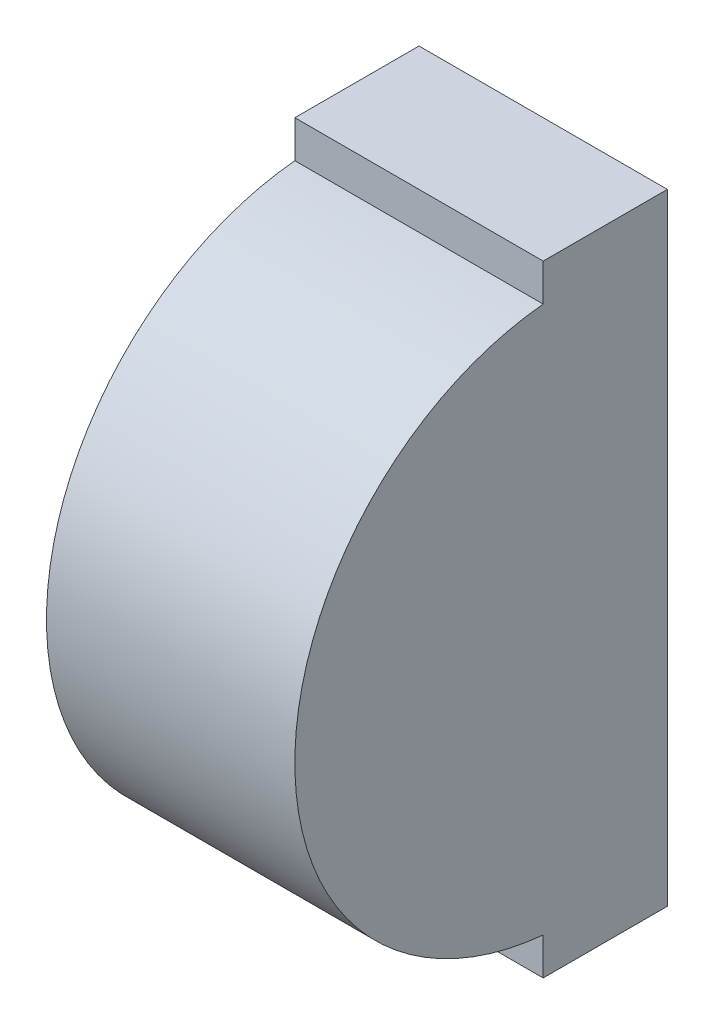
ISO-10303-21;
HEADER;
FILE_DESCRIPTION(('STEP AP214'),'2;1');
FILE_NAME('part.step','',(''),(''),'','','');
FILE_SCHEMA(('AUTOMOTIVE_DESIGN { 1 0 10303 214 1 1 1 1 }'));
ENDSEC;
DATA;
#1=APPLICATION_CONTEXT('core data for automotive mechanical design processes');
#2=APPLICATION_PROTOCOL_DEFINITION('international standard','automotive_design',2000,#1);
#3=PRODUCT_CONTEXT('',#1,'mechanical');
#4=PRODUCT('Part','Part','',(#3));
#5=PRODUCT_RELATED_PRODUCT_CATEGORY('part','',(#4));
#6=PRODUCT_DEFINITION_FORMATION('','',#4);
#7=PRODUCT_DEFINITION_CONTEXT('part definition',#1,'design');
#8=PRODUCT_DEFINITION('design','',#6,#7);
#9=PRODUCT_DEFINITION_SHAPE('','',#8);
#10=(LENGTH_UNIT() NAMED_UNIT(*) SI_UNIT(.MILLI.,.METRE.));
#11=(NAMED_UNIT(*) PLANE_ANGLE_UNIT() SI_UNIT($,.RADIAN.));
#12=(NAMED_UNIT(*) SI_UNIT($,.STERADIAN.) SOLID_ANGLE_UNIT());
#13=UNCERTAINTY_MEASURE_WITH_UNIT(LENGTH_MEASURE(1.E-05),#10,'distance_accuracy_value','');
#14=(GEOMETRIC_REPRESENTATION_CONTEXT(3) GLOBAL_UNCERTAINTY_ASSIGNED_CONTEXT((#13)) GLOBAL_UNIT_ASSIGNED_CONTEXT((#10,
#11,#12)) REPRESENTATION_CONTEXT('',''));
#15=CARTESIAN_POINT('',(0.,0.,0.));
#16=DIRECTION('',(0.,0.,1.));
#17=DIRECTION('',(1.,0.,0.));
#18=AXIS2_PLACEMENT_3D('',#15,#16,#17);
#19=CARTESIAN_POINT('',(0.,0.,0.));
#20=DIRECTION('',(1.,0.,0.));
#21=DIRECTION('',(0.,1.,0.));
#22=AXIS2_PLACEMENT_3D('',#19,#20,#21);
#23=PLANE('',#22);
#24=DIRECTION('',(0.,0.,-1.));
#25=VECTOR('',#24,1.);
#26=CARTESIAN_POINT('',(0.,-1.25,0.5));
#27=LINE('',#26,#25);
#28=CARTESIAN_POINT('',(0.,-1.25,0.5));
#29=VERTEX_POINT('',#28);
#30=CARTESIAN_POINT('',(0.,-1.25,0.));
#31=VERTEX_POINT('',#30);
#32=EDGE_CURVE('E104',#29,#31,#27,.T.);
#33=ORIENTED_EDGE('',*,*,#32,.F.);
#34=DIRECTION('',(0.,-1.,0.));
#35=VECTOR('',#34,1.);
#36=CARTESIAN_POINT('',(0.,-1.1,0.5));
#37=LINE('',#36,#35);
#38=CARTESIAN_POINT('',(0.,-1.1,0.5));
#39=VERTEX_POINT('',#38);
#40=EDGE_CURVE('E36',#39,#29,#37,.T.);
#41=ORIENTED_EDGE('',*,*,#40,.F.);
#42=CARTESIAN_POINT('',(0.,0.,0.395));
#43=DIRECTION('',(1.,0.,0.));
#44=DIRECTION('',(0.,0.995475113122172,0.0950226244343873));
#45=AXIS2_PLACEMENT_3D('',#42,#43,#44);
#46=CIRCLE('',#45,1.105);
#47=CARTESIAN_POINT('',(0.,1.1,0.5));
#48=VERTEX_POINT('',#47);
#49=EDGE_CURVE('E113',#48,#39,#46,.T.);
#50=ORIENTED_EDGE('',*,*,#49,.F.);
#51=DIRECTION('',(0.,-1.,0.));
#52=VECTOR('',#51,1.);
#53=CARTESIAN_POINT('',(0.,1.25,0.5));
#54=LINE('',#53,#52);
#55=CARTESIAN_POINT('',(0.,1.25,0.5));
#56=VERTEX_POINT('',#55);
#57=EDGE_CURVE('E90',#56,#48,#54,.T.);
#58=ORIENTED_EDGE('',*,*,#57,.F.);
#59=DIRECTION('',(0.,0.,1.));
#60=VECTOR('',#59,1.);
#61=CARTESIAN_POINT('',(0.,1.25,0.));
#62=LINE('',#61,#60);
#63=CARTESIAN_POINT('',(0.,1.25,0.));
#64=VERTEX_POINT('',#63);
#65=EDGE_CURVE('E88',#64,#56,#62,.T.);
#66=ORIENTED_EDGE('',*,*,#65,.F.);
#67=DIRECTION('',(0.,1.,0.));
#68=VECTOR('',#67,1.);
#69=CARTESIAN_POINT('',(0.,-1.25,0.));
#70=LINE('',#69,#68);
#71=EDGE_CURVE('E27',#31,#64,#70,.T.);
#72=ORIENTED_EDGE('',*,*,#71,.F.);
#73=EDGE_LOOP('',(#33,#41,#50,#58,#66,#72));
#74=FACE_BOUND('',#73,.T.);
#75=ADVANCED_FACE('F17',(#74),#23,.F.);
#76=CARTESIAN_POINT('',(0.,-1.25,0.));
#77=DIRECTION('',(0.,0.,-1.));
#78=DIRECTION('',(0.,1.,0.));
#79=AXIS2_PLACEMENT_3D('',#76,#77,#78);
#80=PLANE('',#79);
#81=DIRECTION('',(1.,0.,0.));
#82=VECTOR('',#81,1.);
#83=CARTESIAN_POINT('',(0.,1.25,0.));
#84=LINE('',#83,#82);
#85=CARTESIAN_POINT('',(1.,1.25,0.));
#86=VERTEX_POINT('',#85);
#87=EDGE_CURVE('E11',#64,#86,#84,.T.);
#88=ORIENTED_EDGE('',*,*,#87,.T.);
#89=DIRECTION('',(0.,1.,0.));
#90=VECTOR('',#89,1.);
#91=CARTESIAN_POINT('',(1.,-1.25,0.));
#92=LINE('',#91,#90);
#93=CARTESIAN_POINT('',(1.,-1.25,0.));
#94=VERTEX_POINT('',#93);
#95=EDGE_CURVE('E92',#94,#86,#92,.T.);
#96=ORIENTED_EDGE('',*,*,#95,.F.);
#97=DIRECTION('',(1.,0.,0.));
#98=VECTOR('',#97,1.);
#99=CARTESIAN_POINT('',(0.,-1.25,0.));
#100=LINE('',#99,#98);
#101=EDGE_CURVE('E98',#31,#94,#100,.T.);
#102=ORIENTED_EDGE('',*,*,#101,.F.);
#103=ORIENTED_EDGE('',*,*,#71,.T.);
#104=EDGE_LOOP('',(#88,#96,#102,#103));
#105=FACE_BOUND('',#104,.T.);
#106=ADVANCED_FACE('F130',(#105),#80,.T.);
#107=CARTESIAN_POINT('',(0.,-1.25,0.5));
#108=DIRECTION('',(0.,-1.,0.));
#109=DIRECTION('',(0.,0.,-1.));
#110=AXIS2_PLACEMENT_3D('',#107,#108,#109);
#111=PLANE('',#110);
#112=ORIENTED_EDGE('',*,*,#101,.T.);
#113=DIRECTION('',(0.,0.,-1.));
#114=VECTOR('',#113,1.);
#115=CARTESIAN_POINT('',(1.,-1.25,0.5));
#116=LINE('',#115,#114);
#117=CARTESIAN_POINT('',(1.,-1.25,0.5));
#118=VERTEX_POINT('',#117);
#119=EDGE_CURVE('E101',#118,#94,#116,.T.);
#120=ORIENTED_EDGE('',*,*,#119,.F.);
#121=DIRECTION('',(1.,0.,0.));
#122=VECTOR('',#121,1.);
#123=CARTESIAN_POINT('',(0.,-1.25,0.5));
#124=LINE('',#123,#122);
#125=EDGE_CURVE('E107',#29,#118,#124,.T.);
#126=ORIENTED_EDGE('',*,*,#125,.F.);
#127=ORIENTED_EDGE('',*,*,#32,.T.);
#128=EDGE_LOOP('',(#112,#120,#126,#127));
#129=FACE_BOUND('',#128,.T.);
#130=ADVANCED_FACE('F127',(#129),#111,.T.);
#131=CARTESIAN_POINT('',(0.,-1.1,0.5));
#132=DIRECTION('',(0.,0.,1.));
#133=DIRECTION('',(0.,-1.,0.));
#134=AXIS2_PLACEMENT_3D('',#131,#132,#133);
#135=PLANE('',#134);
#136=ORIENTED_EDGE('',*,*,#125,.T.);
#137=DIRECTION('',(0.,-1.,0.));
#138=VECTOR('',#137,1.);
#139=CARTESIAN_POINT('',(1.,-1.1,0.5));
#140=LINE('',#139,#138);
#141=CARTESIAN_POINT('',(1.,-1.1,0.5));
#142=VERTEX_POINT('',#141);
#143=EDGE_CURVE('E106',#142,#118,#140,.T.);
#144=ORIENTED_EDGE('',*,*,#143,.F.);
#145=DIRECTION('',(1.,0.,0.));
#146=VECTOR('',#145,1.);
#147=CARTESIAN_POINT('',(0.,-1.1,0.5));
#148=LINE('',#147,#146);
#149=EDGE_CURVE('E111',#39,#142,#148,.T.);
#150=ORIENTED_EDGE('',*,*,#149,.F.);
#151=ORIENTED_EDGE('',*,*,#40,.T.);
#152=EDGE_LOOP('',(#136,#144,#150,#151));
#153=FACE_BOUND('',#152,.T.);
#154=ADVANCED_FACE('F119',(#153),#135,.T.);
#155=CARTESIAN_POINT('',(0.,0.,0.395));
#156=DIRECTION('',(1.,0.,0.));
#157=DIRECTION('',(0.,1.,0.));
#158=AXIS2_PLACEMENT_3D('',#155,#156,#157);
#159=CYLINDRICAL_SURFACE('',#158,1.105);
#160=ORIENTED_EDGE('',*,*,#149,.T.);
#161=CARTESIAN_POINT('',(1.,0.,0.395));
#162=DIRECTION('',(1.,0.,0.));
#163=DIRECTION('',(0.,0.995475113122172,0.0950226244343873));
#164=AXIS2_PLACEMENT_3D('',#161,#162,#163);
#165=CIRCLE('',#164,1.105);
#166=CARTESIAN_POINT('',(1.,1.1,0.5));
#167=VERTEX_POINT('',#166);
#168=EDGE_CURVE('E70',#167,#142,#165,.T.);
#169=ORIENTED_EDGE('',*,*,#168,.F.);
#170=DIRECTION('',(1.,0.,0.));
#171=VECTOR('',#170,1.);
#172=CARTESIAN_POINT('',(0.,1.1,0.5));
#173=LINE('',#172,#171);
#174=EDGE_CURVE('E80',#48,#167,#173,.T.);
#175=ORIENTED_EDGE('',*,*,#174,.F.);
#176=ORIENTED_EDGE('',*,*,#49,.T.);
#177=EDGE_LOOP('',(#160,#169,#175,#176));
#178=FACE_BOUND('',#177,.T.);
#179=ADVANCED_FACE('F117',(#178),#159,.T.);
#180=CARTESIAN_POINT('',(0.,1.25,0.5));
#181=DIRECTION('',(0.,0.,1.));
#182=DIRECTION('',(0.,-1.,0.));
#183=AXIS2_PLACEMENT_3D('',#180,#181,#182);
#184=PLANE('',#183);
#185=ORIENTED_EDGE('',*,*,#174,.T.);
#186=DIRECTION('',(0.,-1.,0.));
#187=VECTOR('',#186,1.);
#188=CARTESIAN_POINT('',(1.,1.25,0.5));
#189=LINE('',#188,#187);
#190=CARTESIAN_POINT('',(1.,1.25,0.5));
#191=VERTEX_POINT('',#190);
#192=EDGE_CURVE('E76',#191,#167,#189,.T.);
#193=ORIENTED_EDGE('',*,*,#192,.F.);
#194=DIRECTION('',(1.,0.,0.));
#195=VECTOR('',#194,1.);
#196=CARTESIAN_POINT('',(0.,1.25,0.5));
#197=LINE('',#196,#195);
#198=EDGE_CURVE('E79',#56,#191,#197,.T.);
#199=ORIENTED_EDGE('',*,*,#198,.F.);
#200=ORIENTED_EDGE('',*,*,#57,.T.);
#201=EDGE_LOOP('',(#185,#193,#199,#200));
#202=FACE_BOUND('',#201,.T.);
#203=ADVANCED_FACE('F78',(#202),#184,.T.);
#204=CARTESIAN_POINT('',(0.,1.25,0.));
#205=DIRECTION('',(0.,1.,0.));
#206=DIRECTION('',(0.,0.,1.));
#207=AXIS2_PLACEMENT_3D('',#204,#205,#206);
#208=PLANE('',#207);
#209=ORIENTED_EDGE('',*,*,#198,.T.);
#210=DIRECTION('',(0.,0.,1.));
#211=VECTOR('',#210,1.);
#212=CARTESIAN_POINT('',(1.,1.25,0.));
#213=LINE('',#212,#211);
#214=EDGE_CURVE('E21',#86,#191,#213,.T.);
#215=ORIENTED_EDGE('',*,*,#214,.F.);
#216=ORIENTED_EDGE('',*,*,#87,.F.);
#217=ORIENTED_EDGE('',*,*,#65,.T.);
#218=EDGE_LOOP('',(#209,#215,#216,#217));
#219=FACE_BOUND('',#218,.T.);
#220=ADVANCED_FACE('F86',(#219),#208,.T.);
#221=CARTESIAN_POINT('',(1.,0.,0.));
#222=DIRECTION('',(1.,0.,0.));
#223=DIRECTION('',(0.,1.,0.));
#224=AXIS2_PLACEMENT_3D('',#221,#222,#223);
#225=PLANE('',#224);
#226=ORIENTED_EDGE('',*,*,#214,.T.);
#227=ORIENTED_EDGE('',*,*,#192,.T.);
#228=ORIENTED_EDGE('',*,*,#168,.T.);
#229=ORIENTED_EDGE('',*,*,#143,.T.);
#230=ORIENTED_EDGE('',*,*,#119,.T.);
#231=ORIENTED_EDGE('',*,*,#95,.T.);
#232=EDGE_LOOP('',(#226,#227,#228,#229,#230,#231));
#233=FACE_BOUND('',#232,.T.);
#234=ADVANCED_FACE('F19',(#233),#225,.T.);
#235=CLOSED_SHELL('',(#75,#106,#130,#154,#179,#203,#220,#234));
#236=MANIFOLD_SOLID_BREP('B1',#235);
#237=ADVANCED_BREP_SHAPE_REPRESENTATION('',(#18,#236),#14);
#238=SHAPE_DEFINITION_REPRESENTATION(#9,#237);
ENDSEC;
END-ISO-10303-21;
